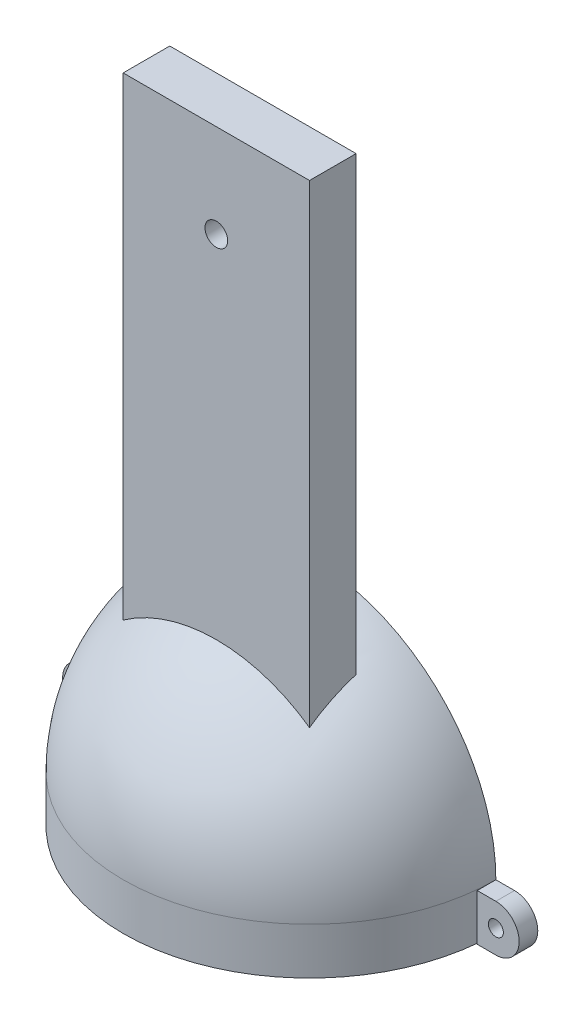
ISO-10303-21;
HEADER;
FILE_DESCRIPTION(('STEP AP214'),'2;1');
FILE_NAME('part.step','',(''),(''),'','','');
FILE_SCHEMA(('AUTOMOTIVE_DESIGN { 1 0 10303 214 1 1 1 1 }'));
ENDSEC;
DATA;
#1=APPLICATION_CONTEXT('core data for automotive mechanical design processes');
#2=APPLICATION_PROTOCOL_DEFINITION('international standard','automotive_design',2000,#1);
#3=PRODUCT_CONTEXT('',#1,'mechanical');
#4=PRODUCT('Part','Part','',(#3));
#5=PRODUCT_RELATED_PRODUCT_CATEGORY('part','',(#4));
#6=PRODUCT_DEFINITION_FORMATION('','',#4);
#7=PRODUCT_DEFINITION_CONTEXT('part definition',#1,'design');
#8=PRODUCT_DEFINITION('design','',#6,#7);
#9=PRODUCT_DEFINITION_SHAPE('','',#8);
#10=(LENGTH_UNIT() NAMED_UNIT(*) SI_UNIT(.MILLI.,.METRE.));
#11=(NAMED_UNIT(*) PLANE_ANGLE_UNIT() SI_UNIT($,.RADIAN.));
#12=(NAMED_UNIT(*) SI_UNIT($,.STERADIAN.) SOLID_ANGLE_UNIT());
#13=UNCERTAINTY_MEASURE_WITH_UNIT(LENGTH_MEASURE(1.E-05),#10,'distance_accuracy_value','');
#14=(GEOMETRIC_REPRESENTATION_CONTEXT(3) GLOBAL_UNCERTAINTY_ASSIGNED_CONTEXT((#13)) GLOBAL_UNIT_ASSIGNED_CONTEXT((#10,
#11,#12)) REPRESENTATION_CONTEXT('',''));
#15=CARTESIAN_POINT('',(0.,0.,0.));
#16=DIRECTION('',(0.,0.,1.));
#17=DIRECTION('',(1.,0.,0.));
#18=AXIS2_PLACEMENT_3D('',#15,#16,#17);
#19=CARTESIAN_POINT('',(-22.,-2.5,2.));
#20=DIRECTION('',(0.,0.,-1.));
#21=DIRECTION('',(-1.,0.,0.));
#22=AXIS2_PLACEMENT_3D('',#19,#20,#21);
#23=CYLINDRICAL_SURFACE('',#22,2.5);
#24=CARTESIAN_POINT('',(-22.,-2.5,0.));
#25=DIRECTION('',(0.,0.,-1.));
#26=DIRECTION('',(1.,0.,0.));
#27=AXIS2_PLACEMENT_3D('',#24,#25,#26);
#28=CIRCLE('',#27,2.5);
#29=CARTESIAN_POINT('',(-22.,-5.,0.));
#30=VERTEX_POINT('',#29);
#31=CARTESIAN_POINT('',(-22.,0.,0.));
#32=VERTEX_POINT('',#31);
#33=EDGE_CURVE('E116',#30,#32,#28,.T.);
#34=ORIENTED_EDGE('',*,*,#33,.F.);
#35=DIRECTION('',(0.,0.,-1.));
#36=VECTOR('',#35,1.);
#37=CARTESIAN_POINT('',(-22.,-5.,2.));
#38=LINE('',#37,#36);
#39=CARTESIAN_POINT('',(-22.,-5.,2.));
#40=VERTEX_POINT('',#39);
#41=EDGE_CURVE('E12',#40,#30,#38,.T.);
#42=ORIENTED_EDGE('',*,*,#41,.F.);
#43=CARTESIAN_POINT('',(-22.,-2.5,2.));
#44=DIRECTION('',(0.,0.,-1.));
#45=DIRECTION('',(1.,0.,0.));
#46=AXIS2_PLACEMENT_3D('',#43,#44,#45);
#47=CIRCLE('',#46,2.5);
#48=CARTESIAN_POINT('',(-22.,0.,2.));
#49=VERTEX_POINT('',#48);
#50=EDGE_CURVE('E109',#40,#49,#47,.T.);
#51=ORIENTED_EDGE('',*,*,#50,.T.);
#52=DIRECTION('',(0.,0.,-1.));
#53=VECTOR('',#52,1.);
#54=CARTESIAN_POINT('',(-22.,0.,2.));
#55=LINE('',#54,#53);
#56=EDGE_CURVE('E54',#49,#32,#55,.T.);
#57=ORIENTED_EDGE('',*,*,#56,.T.);
#58=EDGE_LOOP('',(#34,#42,#51,#57));
#59=FACE_BOUND('',#58,.T.);
#60=ADVANCED_FACE('F51',(#59),#23,.T.);
#61=CARTESIAN_POINT('',(-22.,-5.,2.));
#62=DIRECTION('',(0.,-1.,0.));
#63=DIRECTION('',(0.,0.,-1.));
#64=AXIS2_PLACEMENT_3D('',#61,#62,#63);
#65=PLANE('',#64);
#66=DIRECTION('',(-1.,0.,0.));
#67=VECTOR('',#66,1.);
#68=CARTESIAN_POINT('',(-22.,-5.,0.));
#69=LINE('',#68,#67);
#70=CARTESIAN_POINT('',(-20.,-5.,0.));
#71=VERTEX_POINT('',#70);
#72=EDGE_CURVE('E111',#71,#30,#69,.T.);
#73=ORIENTED_EDGE('',*,*,#72,.F.);
#74=DIRECTION('',(0.,0.,-1.));
#75=VECTOR('',#74,1.);
#76=CARTESIAN_POINT('',(-20.,-5.,2.));
#77=LINE('',#76,#75);
#78=CARTESIAN_POINT('',(-20.,-5.,2.));
#79=VERTEX_POINT('',#78);
#80=EDGE_CURVE('E60',#79,#71,#77,.T.);
#81=ORIENTED_EDGE('',*,*,#80,.F.);
#82=DIRECTION('',(-1.,0.,0.));
#83=VECTOR('',#82,1.);
#84=CARTESIAN_POINT('',(-22.,-5.,2.));
#85=LINE('',#84,#83);
#86=EDGE_CURVE('E106',#79,#40,#85,.T.);
#87=ORIENTED_EDGE('',*,*,#86,.T.);
#88=ORIENTED_EDGE('',*,*,#41,.T.);
#89=EDGE_LOOP('',(#73,#81,#87,#88));
#90=FACE_BOUND('',#89,.T.);
#91=ADVANCED_FACE('F127',(#90),#65,.T.);
#92=CARTESIAN_POINT('',(-20.,-5.,2.));
#93=DIRECTION('',(1.,0.,0.));
#94=DIRECTION('',(0.,1.,0.));
#95=AXIS2_PLACEMENT_3D('',#92,#93,#94);
#96=PLANE('',#95);
#97=DIRECTION('',(0.,-1.,0.));
#98=VECTOR('',#97,1.);
#99=CARTESIAN_POINT('',(-20.,-5.,0.));
#100=LINE('',#99,#98);
#101=CARTESIAN_POINT('',(-20.,0.,0.));
#102=VERTEX_POINT('',#101);
#103=EDGE_CURVE('E101',#102,#71,#100,.T.);
#104=ORIENTED_EDGE('',*,*,#103,.F.);
#105=DIRECTION('',(0.,0.,-1.));
#106=VECTOR('',#105,1.);
#107=CARTESIAN_POINT('',(-20.,0.,2.));
#108=LINE('',#107,#106);
#109=CARTESIAN_POINT('',(-20.,0.,2.));
#110=VERTEX_POINT('',#109);
#111=EDGE_CURVE('E96',#110,#102,#108,.T.);
#112=ORIENTED_EDGE('',*,*,#111,.F.);
#113=DIRECTION('',(0.,-1.,0.));
#114=VECTOR('',#113,1.);
#115=CARTESIAN_POINT('',(-20.,-5.,2.));
#116=LINE('',#115,#114);
#117=EDGE_CURVE('E99',#110,#79,#116,.T.);
#118=ORIENTED_EDGE('',*,*,#117,.T.);
#119=ORIENTED_EDGE('',*,*,#80,.T.);
#120=EDGE_LOOP('',(#104,#112,#118,#119));
#121=FACE_BOUND('',#120,.T.);
#122=ADVANCED_FACE('F98',(#121),#96,.T.);
#123=CARTESIAN_POINT('',(-22.,0.,2.));
#124=DIRECTION('',(0.,1.,0.));
#125=DIRECTION('',(0.,0.,1.));
#126=AXIS2_PLACEMENT_3D('',#123,#124,#125);
#127=PLANE('',#126);
#128=DIRECTION('',(1.,0.,0.));
#129=VECTOR('',#128,1.);
#130=CARTESIAN_POINT('',(-22.,0.,0.));
#131=LINE('',#130,#129);
#132=EDGE_CURVE('E119',#32,#102,#131,.T.);
#133=ORIENTED_EDGE('',*,*,#132,.F.);
#134=ORIENTED_EDGE('',*,*,#56,.F.);
#135=DIRECTION('',(1.,0.,0.));
#136=VECTOR('',#135,1.);
#137=CARTESIAN_POINT('',(-22.,0.,2.));
#138=LINE('',#137,#136);
#139=EDGE_CURVE('E105',#49,#110,#138,.T.);
#140=ORIENTED_EDGE('',*,*,#139,.T.);
#141=ORIENTED_EDGE('',*,*,#111,.T.);
#142=EDGE_LOOP('',(#133,#134,#140,#141));
#143=FACE_BOUND('',#142,.T.);
#144=ADVANCED_FACE('F108',(#143),#127,.T.);
#145=CARTESIAN_POINT('',(-22.,-2.5,2.));
#146=DIRECTION('',(0.,0.,1.));
#147=DIRECTION('',(1.,0.,0.));
#148=AXIS2_PLACEMENT_3D('',#145,#146,#147);
#149=PLANE('',#148);
#150=CARTESIAN_POINT('',(-22.,-2.5,2.));
#151=DIRECTION('',(0.,0.,1.));
#152=DIRECTION('',(1.,0.,0.));
#153=AXIS2_PLACEMENT_3D('',#150,#151,#152);
#154=CIRCLE('',#153,0.805000000000001);
#155=CARTESIAN_POINT('',(-21.195,-2.5,2.));
#156=VERTEX_POINT('',#155);
#157=EDGE_CURVE('E120',#156,#156,#154,.T.);
#158=ORIENTED_EDGE('',*,*,#157,.F.);
#159=EDGE_LOOP('',(#158));
#160=FACE_BOUND('',#159,.T.);
#161=ORIENTED_EDGE('',*,*,#50,.F.);
#162=ORIENTED_EDGE('',*,*,#86,.F.);
#163=ORIENTED_EDGE('',*,*,#117,.F.);
#164=ORIENTED_EDGE('',*,*,#139,.F.);
#165=EDGE_LOOP('',(#161,#162,#163,#164));
#166=FACE_BOUND('',#165,.T.);
#167=ADVANCED_FACE('F104',(#160,#166),#149,.T.);
#168=CARTESIAN_POINT('',(-22.,-2.5,0.));
#169=DIRECTION('',(0.,0.,1.));
#170=DIRECTION('',(1.,0.,0.));
#171=AXIS2_PLACEMENT_3D('',#168,#169,#170);
#172=PLANE('',#171);
#173=CARTESIAN_POINT('',(-22.,-2.5,0.));
#174=DIRECTION('',(0.,0.,-1.));
#175=DIRECTION('',(-1.,0.,0.));
#176=AXIS2_PLACEMENT_3D('',#173,#174,#175);
#177=CIRCLE('',#176,0.805000000000001);
#178=CARTESIAN_POINT('',(-22.805,-2.5,0.));
#179=VERTEX_POINT('',#178);
#180=EDGE_CURVE('E157',#179,#179,#177,.T.);
#181=ORIENTED_EDGE('',*,*,#180,.F.);
#182=EDGE_LOOP('',(#181));
#183=FACE_BOUND('',#182,.T.);
#184=ORIENTED_EDGE('',*,*,#33,.T.);
#185=ORIENTED_EDGE('',*,*,#132,.T.);
#186=ORIENTED_EDGE('',*,*,#103,.T.);
#187=ORIENTED_EDGE('',*,*,#72,.T.);
#188=EDGE_LOOP('',(#184,#185,#186,#187));
#189=FACE_BOUND('',#188,.T.);
#190=ADVANCED_FACE('F126',(#183,#189),#172,.F.);
#191=CARTESIAN_POINT('',(-22.,-2.5,10.));
#192=DIRECTION('',(0.,0.,-1.));
#193=DIRECTION('',(-1.,0.,0.));
#194=AXIS2_PLACEMENT_3D('',#191,#192,#193);
#195=CYLINDRICAL_SURFACE('',#194,0.805000000000001);
#196=ORIENTED_EDGE('',*,*,#157,.T.);
#197=EDGE_LOOP('',(#196));
#198=FACE_BOUND('',#197,.T.);
#199=ORIENTED_EDGE('',*,*,#180,.T.);
#200=EDGE_LOOP('',(#199));
#201=FACE_BOUND('',#200,.T.);
#202=ADVANCED_FACE('F145',(#198,#201),#195,.F.);
#203=CLOSED_SHELL('',(#60,#91,#122,#144,#167,#190,#202));
#204=MANIFOLD_SOLID_BREP('B2',#203);
#205=CARTESIAN_POINT('',(20.,0.,2.));
#206=DIRECTION('',(-1.,0.,0.));
#207=DIRECTION('',(0.,-1.,0.));
#208=AXIS2_PLACEMENT_3D('',#205,#206,#207);
#209=PLANE('',#208);
#210=DIRECTION('',(0.,1.,0.));
#211=VECTOR('',#210,1.);
#212=CARTESIAN_POINT('',(20.,0.,0.));
#213=LINE('',#212,#211);
#214=CARTESIAN_POINT('',(20.,-5.,0.));
#215=VERTEX_POINT('',#214);
#216=CARTESIAN_POINT('',(20.,0.,0.));
#217=VERTEX_POINT('',#216);
#218=EDGE_CURVE('E269',#215,#217,#213,.T.);
#219=ORIENTED_EDGE('',*,*,#218,.F.);
#220=DIRECTION('',(0.,0.,-1.));
#221=VECTOR('',#220,1.);
#222=CARTESIAN_POINT('',(20.,-5.,2.));
#223=LINE('',#222,#221);
#224=CARTESIAN_POINT('',(20.,-5.,2.));
#225=VERTEX_POINT('',#224);
#226=EDGE_CURVE('E49',#225,#215,#223,.T.);
#227=ORIENTED_EDGE('',*,*,#226,.F.);
#228=DIRECTION('',(0.,1.,0.));
#229=VECTOR('',#228,1.);
#230=CARTESIAN_POINT('',(20.,0.,2.));
#231=LINE('',#230,#229);
#232=CARTESIAN_POINT('',(20.,0.,2.));
#233=VERTEX_POINT('',#232);
#234=EDGE_CURVE('E262',#225,#233,#231,.T.);
#235=ORIENTED_EDGE('',*,*,#234,.T.);
#236=DIRECTION('',(0.,0.,-1.));
#237=VECTOR('',#236,1.);
#238=CARTESIAN_POINT('',(20.,0.,2.));
#239=LINE('',#238,#237);
#240=EDGE_CURVE('E207',#233,#217,#239,.T.);
#241=ORIENTED_EDGE('',*,*,#240,.T.);
#242=EDGE_LOOP('',(#219,#227,#235,#241));
#243=FACE_BOUND('',#242,.T.);
#244=ADVANCED_FACE('F204',(#243),#209,.T.);
#245=CARTESIAN_POINT('',(22.,-5.,2.));
#246=DIRECTION('',(0.,-1.,0.));
#247=DIRECTION('',(0.,0.,-1.));
#248=AXIS2_PLACEMENT_3D('',#245,#246,#247);
#249=PLANE('',#248);
#250=DIRECTION('',(-1.,0.,0.));
#251=VECTOR('',#250,1.);
#252=CARTESIAN_POINT('',(22.,-5.,0.));
#253=LINE('',#252,#251);
#254=CARTESIAN_POINT('',(22.,-5.,0.));
#255=VERTEX_POINT('',#254);
#256=EDGE_CURVE('E264',#255,#215,#253,.T.);
#257=ORIENTED_EDGE('',*,*,#256,.F.);
#258=DIRECTION('',(0.,0.,-1.));
#259=VECTOR('',#258,1.);
#260=CARTESIAN_POINT('',(22.,-5.,2.));
#261=LINE('',#260,#259);
#262=CARTESIAN_POINT('',(22.,-5.,2.));
#263=VERTEX_POINT('',#262);
#264=EDGE_CURVE('E213',#263,#255,#261,.T.);
#265=ORIENTED_EDGE('',*,*,#264,.F.);
#266=DIRECTION('',(-1.,0.,0.));
#267=VECTOR('',#266,1.);
#268=CARTESIAN_POINT('',(22.,-5.,2.));
#269=LINE('',#268,#267);
#270=EDGE_CURVE('E259',#263,#225,#269,.T.);
#271=ORIENTED_EDGE('',*,*,#270,.T.);
#272=ORIENTED_EDGE('',*,*,#226,.T.);
#273=EDGE_LOOP('',(#257,#265,#271,#272));
#274=FACE_BOUND('',#273,.T.);
#275=ADVANCED_FACE('F280',(#274),#249,.T.);
#276=CARTESIAN_POINT('',(22.,-2.5,2.));
#277=DIRECTION('',(0.,0.,-1.));
#278=DIRECTION('',(-1.,0.,0.));
#279=AXIS2_PLACEMENT_3D('',#276,#277,#278);
#280=CYLINDRICAL_SURFACE('',#279,2.5);
#281=CARTESIAN_POINT('',(22.,-2.5,0.));
#282=DIRECTION('',(0.,0.,-1.));
#283=DIRECTION('',(-1.,0.,0.));
#284=AXIS2_PLACEMENT_3D('',#281,#282,#283);
#285=CIRCLE('',#284,2.5);
#286=CARTESIAN_POINT('',(22.,0.,0.));
#287=VERTEX_POINT('',#286);
#288=EDGE_CURVE('E254',#287,#255,#285,.T.);
#289=ORIENTED_EDGE('',*,*,#288,.F.);
#290=DIRECTION('',(0.,0.,-1.));
#291=VECTOR('',#290,1.);
#292=CARTESIAN_POINT('',(22.,0.,2.));
#293=LINE('',#292,#291);
#294=CARTESIAN_POINT('',(22.,0.,2.));
#295=VERTEX_POINT('',#294);
#296=EDGE_CURVE('E249',#295,#287,#293,.T.);
#297=ORIENTED_EDGE('',*,*,#296,.F.);
#298=CARTESIAN_POINT('',(22.,-2.5,2.));
#299=DIRECTION('',(0.,0.,-1.));
#300=DIRECTION('',(-1.,0.,0.));
#301=AXIS2_PLACEMENT_3D('',#298,#299,#300);
#302=CIRCLE('',#301,2.5);
#303=EDGE_CURVE('E252',#295,#263,#302,.T.);
#304=ORIENTED_EDGE('',*,*,#303,.T.);
#305=ORIENTED_EDGE('',*,*,#264,.T.);
#306=EDGE_LOOP('',(#289,#297,#304,#305));
#307=FACE_BOUND('',#306,.T.);
#308=ADVANCED_FACE('F251',(#307),#280,.T.);
#309=CARTESIAN_POINT('',(22.,0.,2.));
#310=DIRECTION('',(0.,1.,0.));
#311=DIRECTION('',(0.,0.,1.));
#312=AXIS2_PLACEMENT_3D('',#309,#310,#311);
#313=PLANE('',#312);
#314=DIRECTION('',(1.,0.,0.));
#315=VECTOR('',#314,1.);
#316=CARTESIAN_POINT('',(22.,0.,0.));
#317=LINE('',#316,#315);
#318=EDGE_CURVE('E272',#217,#287,#317,.T.);
#319=ORIENTED_EDGE('',*,*,#318,.F.);
#320=ORIENTED_EDGE('',*,*,#240,.F.);
#321=DIRECTION('',(1.,0.,0.));
#322=VECTOR('',#321,1.);
#323=CARTESIAN_POINT('',(22.,0.,2.));
#324=LINE('',#323,#322);
#325=EDGE_CURVE('E258',#233,#295,#324,.T.);
#326=ORIENTED_EDGE('',*,*,#325,.T.);
#327=ORIENTED_EDGE('',*,*,#296,.T.);
#328=EDGE_LOOP('',(#319,#320,#326,#327));
#329=FACE_BOUND('',#328,.T.);
#330=ADVANCED_FACE('F261',(#329),#313,.T.);
#331=CARTESIAN_POINT('',(22.,-2.5,2.));
#332=DIRECTION('',(0.,0.,-1.));
#333=DIRECTION('',(-1.,0.,0.));
#334=AXIS2_PLACEMENT_3D('',#331,#332,#333);
#335=PLANE('',#334);
#336=CARTESIAN_POINT('',(22.,-2.5,2.));
#337=DIRECTION('',(0.,0.,-1.));
#338=DIRECTION('',(-1.,0.,0.));
#339=AXIS2_PLACEMENT_3D('',#336,#337,#338);
#340=CIRCLE('',#339,0.805000000000001);
#341=CARTESIAN_POINT('',(21.195,-2.5,2.));
#342=VERTEX_POINT('',#341);
#343=EDGE_CURVE('E273',#342,#342,#340,.T.);
#344=ORIENTED_EDGE('',*,*,#343,.T.);
#345=EDGE_LOOP('',(#344));
#346=FACE_BOUND('',#345,.T.);
#347=ORIENTED_EDGE('',*,*,#234,.F.);
#348=ORIENTED_EDGE('',*,*,#270,.F.);
#349=ORIENTED_EDGE('',*,*,#303,.F.);
#350=ORIENTED_EDGE('',*,*,#325,.F.);
#351=EDGE_LOOP('',(#347,#348,#349,#350));
#352=FACE_BOUND('',#351,.T.);
#353=ADVANCED_FACE('F257',(#346,#352),#335,.F.);
#354=CARTESIAN_POINT('',(22.,-2.5,0.));
#355=DIRECTION('',(0.,0.,-1.));
#356=DIRECTION('',(-1.,0.,0.));
#357=AXIS2_PLACEMENT_3D('',#354,#355,#356);
#358=PLANE('',#357);
#359=CARTESIAN_POINT('',(22.,-2.5,0.));
#360=DIRECTION('',(0.,0.,-1.));
#361=DIRECTION('',(-1.,0.,0.));
#362=AXIS2_PLACEMENT_3D('',#359,#360,#361);
#363=CIRCLE('',#362,0.805000000000001);
#364=CARTESIAN_POINT('',(21.195,-2.5,0.));
#365=VERTEX_POINT('',#364);
#366=EDGE_CURVE('E309',#365,#365,#363,.T.);
#367=ORIENTED_EDGE('',*,*,#366,.F.);
#368=EDGE_LOOP('',(#367));
#369=FACE_BOUND('',#368,.T.);
#370=ORIENTED_EDGE('',*,*,#218,.T.);
#371=ORIENTED_EDGE('',*,*,#318,.T.);
#372=ORIENTED_EDGE('',*,*,#288,.T.);
#373=ORIENTED_EDGE('',*,*,#256,.T.);
#374=EDGE_LOOP('',(#370,#371,#372,#373));
#375=FACE_BOUND('',#374,.T.);
#376=ADVANCED_FACE('F279',(#369,#375),#358,.T.);
#377=CARTESIAN_POINT('',(22.,-2.5,10.));
#378=DIRECTION('',(0.,0.,-1.));
#379=DIRECTION('',(-1.,0.,0.));
#380=AXIS2_PLACEMENT_3D('',#377,#378,#379);
#381=CYLINDRICAL_SURFACE('',#380,0.805000000000001);
#382=ORIENTED_EDGE('',*,*,#366,.T.);
#383=EDGE_LOOP('',(#382));
#384=FACE_BOUND('',#383,.T.);
#385=ORIENTED_EDGE('',*,*,#343,.F.);
#386=EDGE_LOOP('',(#385));
#387=FACE_BOUND('',#386,.T.);
#388=ADVANCED_FACE('F298',(#384,#387),#381,.F.);
#389=CLOSED_SHELL('',(#244,#275,#308,#330,#353,#376,#388));
#390=MANIFOLD_SOLID_BREP('B6',#389);
#391=CARTESIAN_POINT('',(0.,0.,0.));
#392=DIRECTION('',(-1.,0.,0.));
#393=DIRECTION('',(0.,0.,1.));
#394=AXIS2_PLACEMENT_3D('',#391,#392,#393);
#395=SPHERICAL_SURFACE('',#394,20.);
#396=CARTESIAN_POINT('',(0.,0.,0.));
#397=DIRECTION('',(0.,0.,1.));
#398=DIRECTION('',(1.,0.,0.));
#399=AXIS2_PLACEMENT_3D('',#396,#397,#398);
#400=CIRCLE('',#399,20.);
#401=CARTESIAN_POINT('',(20.,0.,0.));
#402=VERTEX_POINT('',#401);
#403=CARTESIAN_POINT('',(-20.,0.,0.));
#404=VERTEX_POINT('',#403);
#405=EDGE_CURVE('E476',#402,#404,#400,.T.);
#406=ORIENTED_EDGE('',*,*,#405,.T.);
#407=CARTESIAN_POINT('',(0.,0.,0.));
#408=DIRECTION('',(0.,-1.,0.));
#409=DIRECTION('',(1.,0.,0.));
#410=AXIS2_PLACEMENT_3D('',#407,#408,#409);
#411=CIRCLE('',#410,20.);
#412=EDGE_CURVE('E428',#402,#404,#411,.T.);
#413=ORIENTED_EDGE('',*,*,#412,.F.);
#414=EDGE_LOOP('',(#406,#413));
#415=FACE_BOUND('',#414,.T.);
#416=CARTESIAN_POINT('',(9.99999999999999,0.,0.));
#417=DIRECTION('',(-1.,0.,0.));
#418=DIRECTION('',(0.,0.,1.));
#419=AXIS2_PLACEMENT_3D('',#416,#417,#418);
#420=CIRCLE('',#419,17.3205080756888);
#421=CARTESIAN_POINT('',(10.,14.142135623731,10.));
#422=VERTEX_POINT('',#421);
#423=CARTESIAN_POINT('',(10.,16.583123951777,5.));
#424=VERTEX_POINT('',#423);
#425=EDGE_CURVE('E355',#422,#424,#420,.T.);
#426=ORIENTED_EDGE('',*,*,#425,.F.);
#427=CARTESIAN_POINT('',(0.,0.,10.));
#428=DIRECTION('',(0.,0.,-1.));
#429=DIRECTION('',(-1.,0.,0.));
#430=AXIS2_PLACEMENT_3D('',#427,#428,#429);
#431=CIRCLE('',#430,17.3205080756888);
#432=CARTESIAN_POINT('',(-10.,14.1421356237309,10.));
#433=VERTEX_POINT('',#432);
#434=EDGE_CURVE('E414',#433,#422,#431,.T.);
#435=ORIENTED_EDGE('',*,*,#434,.F.);
#436=CARTESIAN_POINT('',(-10.,0.,0.));
#437=DIRECTION('',(1.,0.,0.));
#438=DIRECTION('',(0.,0.,-1.));
#439=AXIS2_PLACEMENT_3D('',#436,#437,#438);
#440=CIRCLE('',#439,17.3205080756888);
#441=CARTESIAN_POINT('',(-10.,16.583123951777,5.));
#442=VERTEX_POINT('',#441);
#443=EDGE_CURVE('E367',#442,#433,#440,.T.);
#444=ORIENTED_EDGE('',*,*,#443,.F.);
#445=CARTESIAN_POINT('',(0.,0.,5.));
#446=DIRECTION('',(0.,0.,1.));
#447=DIRECTION('',(1.,0.,0.));
#448=AXIS2_PLACEMENT_3D('',#445,#446,#447);
#449=CIRCLE('',#448,19.3649167310371);
#450=EDGE_CURVE('E362',#424,#442,#449,.T.);
#451=ORIENTED_EDGE('',*,*,#450,.F.);
#452=EDGE_LOOP('',(#426,#435,#444,#451));
#453=FACE_BOUND('',#452,.T.);
#454=ADVANCED_FACE('F348',(#415,#453),#395,.T.);
#455=CARTESIAN_POINT('',(0.,0.,0.));
#456=DIRECTION('',(-1.,0.,0.));
#457=DIRECTION('',(0.,0.,1.));
#458=AXIS2_PLACEMENT_3D('',#455,#456,#457);
#459=SPHERICAL_SURFACE('',#458,15.);
#460=CARTESIAN_POINT('',(0.,0.,0.));
#461=DIRECTION('',(0.,0.,1.));
#462=DIRECTION('',(1.,0.,0.));
#463=AXIS2_PLACEMENT_3D('',#460,#461,#462);
#464=CIRCLE('',#463,15.);
#465=CARTESIAN_POINT('',(15.,0.,0.));
#466=VERTEX_POINT('',#465);
#467=CARTESIAN_POINT('',(-15.,0.,0.));
#468=VERTEX_POINT('',#467);
#469=EDGE_CURVE('E473',#466,#468,#464,.T.);
#470=ORIENTED_EDGE('',*,*,#469,.F.);
#471=CARTESIAN_POINT('',(0.,0.,0.));
#472=DIRECTION('',(0.,-1.,0.));
#473=DIRECTION('',(1.,0.,0.));
#474=AXIS2_PLACEMENT_3D('',#471,#472,#473);
#475=CIRCLE('',#474,15.);
#476=EDGE_CURVE('E479',#466,#468,#475,.T.);
#477=ORIENTED_EDGE('',*,*,#476,.T.);
#478=EDGE_LOOP('',(#470,#477));
#479=FACE_BOUND('',#478,.T.);
#480=ADVANCED_FACE('F535',(#479),#459,.F.);
#481=CARTESIAN_POINT('',(0.,0.,0.));
#482=DIRECTION('',(0.,0.,1.));
#483=DIRECTION('',(1.,0.,0.));
#484=AXIS2_PLACEMENT_3D('',#481,#482,#483);
#485=PLANE('',#484);
#486=ORIENTED_EDGE('',*,*,#469,.T.);
#487=DIRECTION('',(1.,0.,0.));
#488=VECTOR('',#487,1.);
#489=CARTESIAN_POINT('',(-20.,0.,0.));
#490=LINE('',#489,#488);
#491=CARTESIAN_POINT('',(-10.,0.,0.));
#492=VERTEX_POINT('',#491);
#493=EDGE_CURVE('E450',#468,#492,#490,.T.);
#494=ORIENTED_EDGE('',*,*,#493,.T.);
#495=DIRECTION('',(0.,1.,0.));
#496=VECTOR('',#495,1.);
#497=CARTESIAN_POINT('',(-10.,-5.,0.));
#498=LINE('',#497,#496);
#499=CARTESIAN_POINT('',(-10.,-5.,0.));
#500=VERTEX_POINT('',#499);
#501=EDGE_CURVE('E456',#500,#492,#498,.T.);
#502=ORIENTED_EDGE('',*,*,#501,.F.);
#503=DIRECTION('',(1.,0.,0.));
#504=VECTOR('',#503,1.);
#505=CARTESIAN_POINT('',(-20.,-5.,0.));
#506=LINE('',#505,#504);
#507=CARTESIAN_POINT('',(-20.,-5.,0.));
#508=VERTEX_POINT('',#507);
#509=EDGE_CURVE('E454',#508,#500,#506,.T.);
#510=ORIENTED_EDGE('',*,*,#509,.F.);
#511=DIRECTION('',(0.,1.,0.));
#512=VECTOR('',#511,1.);
#513=CARTESIAN_POINT('',(-20.,-5.,0.));
#514=LINE('',#513,#512);
#515=EDGE_CURVE('E465',#508,#404,#514,.T.);
#516=ORIENTED_EDGE('',*,*,#515,.T.);
#517=ORIENTED_EDGE('',*,*,#405,.F.);
#518=DIRECTION('',(0.,1.,0.));
#519=VECTOR('',#518,1.);
#520=CARTESIAN_POINT('',(20.,-5.,0.));
#521=LINE('',#520,#519);
#522=CARTESIAN_POINT('',(20.,-5.,0.));
#523=VERTEX_POINT('',#522);
#524=EDGE_CURVE('E468',#523,#402,#521,.T.);
#525=ORIENTED_EDGE('',*,*,#524,.F.);
#526=DIRECTION('',(1.,0.,0.));
#527=VECTOR('',#526,1.);
#528=CARTESIAN_POINT('',(10.,-5.,0.));
#529=LINE('',#528,#527);
#530=CARTESIAN_POINT('',(10.,-5.,0.));
#531=VERTEX_POINT('',#530);
#532=EDGE_CURVE('E449',#531,#523,#529,.T.);
#533=ORIENTED_EDGE('',*,*,#532,.F.);
#534=DIRECTION('',(0.,1.,0.));
#535=VECTOR('',#534,1.);
#536=CARTESIAN_POINT('',(10.,-5.,0.));
#537=LINE('',#536,#535);
#538=CARTESIAN_POINT('',(10.,0.,0.));
#539=VERTEX_POINT('',#538);
#540=EDGE_CURVE('E470',#531,#539,#537,.T.);
#541=ORIENTED_EDGE('',*,*,#540,.T.);
#542=DIRECTION('',(1.,0.,0.));
#543=VECTOR('',#542,1.);
#544=CARTESIAN_POINT('',(10.,0.,0.));
#545=LINE('',#544,#543);
#546=EDGE_CURVE('E459',#539,#466,#545,.T.);
#547=ORIENTED_EDGE('',*,*,#546,.T.);
#548=EDGE_LOOP('',(#486,#494,#502,#510,#516,#517,#525,#533,#541,#547));
#549=FACE_BOUND('',#548,.T.);
#550=ADVANCED_FACE('F540',(#549),#485,.F.);
#551=CARTESIAN_POINT('',(0.,0.,0.));
#552=DIRECTION('',(0.,-1.,0.));
#553=DIRECTION('',(0.,0.,-1.));
#554=AXIS2_PLACEMENT_3D('',#551,#552,#553);
#555=PLANE('',#554);
#556=ORIENTED_EDGE('',*,*,#476,.F.);
#557=ORIENTED_EDGE('',*,*,#546,.F.);
#558=CARTESIAN_POINT('',(0.,0.,0.));
#559=DIRECTION('',(0.,1.,0.));
#560=DIRECTION('',(0.,0.,-1.));
#561=AXIS2_PLACEMENT_3D('',#558,#559,#560);
#562=CIRCLE('',#561,10.);
#563=EDGE_CURVE('E445',#492,#539,#562,.T.);
#564=ORIENTED_EDGE('',*,*,#563,.F.);
#565=ORIENTED_EDGE('',*,*,#493,.F.);
#566=EDGE_LOOP('',(#556,#557,#564,#565));
#567=FACE_BOUND('',#566,.T.);
#568=ADVANCED_FACE('F561',(#567),#555,.F.);
#569=CARTESIAN_POINT('',(0.,-5.,0.));
#570=DIRECTION('',(0.,1.,0.));
#571=DIRECTION('',(0.,0.,1.));
#572=AXIS2_PLACEMENT_3D('',#569,#570,#571);
#573=CYLINDRICAL_SURFACE('',#572,10.);
#574=ORIENTED_EDGE('',*,*,#563,.T.);
#575=ORIENTED_EDGE('',*,*,#540,.F.);
#576=CARTESIAN_POINT('',(0.,-5.,0.));
#577=DIRECTION('',(0.,1.,0.));
#578=DIRECTION('',(0.,0.,-1.));
#579=AXIS2_PLACEMENT_3D('',#576,#577,#578);
#580=CIRCLE('',#579,10.);
#581=EDGE_CURVE('E446',#500,#531,#580,.T.);
#582=ORIENTED_EDGE('',*,*,#581,.F.);
#583=ORIENTED_EDGE('',*,*,#501,.T.);
#584=EDGE_LOOP('',(#574,#575,#582,#583));
#585=FACE_BOUND('',#584,.T.);
#586=ADVANCED_FACE('F559',(#585),#573,.F.);
#587=CARTESIAN_POINT('',(0.,-5.,0.));
#588=DIRECTION('',(0.,1.,0.));
#589=DIRECTION('',(0.,0.,1.));
#590=AXIS2_PLACEMENT_3D('',#587,#588,#589);
#591=CYLINDRICAL_SURFACE('',#590,20.);
#592=ORIENTED_EDGE('',*,*,#412,.T.);
#593=ORIENTED_EDGE('',*,*,#515,.F.);
#594=CARTESIAN_POINT('',(0.,-5.,0.));
#595=DIRECTION('',(0.,-1.,0.));
#596=DIRECTION('',(0.,0.,-1.));
#597=AXIS2_PLACEMENT_3D('',#594,#595,#596);
#598=CIRCLE('',#597,20.);
#599=EDGE_CURVE('E452',#523,#508,#598,.T.);
#600=ORIENTED_EDGE('',*,*,#599,.F.);
#601=ORIENTED_EDGE('',*,*,#524,.T.);
#602=EDGE_LOOP('',(#592,#593,#600,#601));
#603=FACE_BOUND('',#602,.T.);
#604=ADVANCED_FACE('F551',(#603),#591,.T.);
#605=CARTESIAN_POINT('',(0.,-5.,0.));
#606=DIRECTION('',(0.,-1.,0.));
#607=DIRECTION('',(0.,0.,-1.));
#608=AXIS2_PLACEMENT_3D('',#605,#606,#607);
#609=PLANE('',#608);
#610=ORIENTED_EDGE('',*,*,#581,.T.);
#611=ORIENTED_EDGE('',*,*,#532,.T.);
#612=ORIENTED_EDGE('',*,*,#599,.T.);
#613=ORIENTED_EDGE('',*,*,#509,.T.);
#614=EDGE_LOOP('',(#610,#611,#612,#613));
#615=FACE_BOUND('',#614,.T.);
#616=ADVANCED_FACE('F553',(#615),#609,.T.);
#617=CARTESIAN_POINT('',(-10.,65.,5.));
#618=DIRECTION('',(1.,0.,0.));
#619=DIRECTION('',(0.,0.,-1.));
#620=AXIS2_PLACEMENT_3D('',#617,#618,#619);
#621=PLANE('',#620);
#622=DIRECTION('',(0.,-1.,0.));
#623=VECTOR('',#622,1.);
#624=CARTESIAN_POINT('',(-10.,65.,5.));
#625=LINE('',#624,#623);
#626=CARTESIAN_POINT('',(-10.,65.,5.));
#627=VERTEX_POINT('',#626);
#628=EDGE_CURVE('E435',#627,#442,#625,.T.);
#629=ORIENTED_EDGE('',*,*,#628,.T.);
#630=ORIENTED_EDGE('',*,*,#443,.T.);
#631=DIRECTION('',(0.,-1.,0.));
#632=VECTOR('',#631,1.);
#633=CARTESIAN_POINT('',(-10.,65.,10.));
#634=LINE('',#633,#632);
#635=CARTESIAN_POINT('',(-10.,65.,10.));
#636=VERTEX_POINT('',#635);
#637=EDGE_CURVE('E427',#636,#433,#634,.T.);
#638=ORIENTED_EDGE('',*,*,#637,.F.);
#639=DIRECTION('',(0.,0.,1.));
#640=VECTOR('',#639,1.);
#641=CARTESIAN_POINT('',(-10.,65.,5.));
#642=LINE('',#641,#640);
#643=EDGE_CURVE('E437',#627,#636,#642,.T.);
#644=ORIENTED_EDGE('',*,*,#643,.F.);
#645=EDGE_LOOP('',(#629,#630,#638,#644));
#646=FACE_BOUND('',#645,.T.);
#647=ADVANCED_FACE('F489',(#646),#621,.F.);
#648=CARTESIAN_POINT('',(10.,65.,10.));
#649=DIRECTION('',(0.,0.,-1.));
#650=DIRECTION('',(-1.,0.,0.));
#651=AXIS2_PLACEMENT_3D('',#648,#649,#650);
#652=PLANE('',#651);
#653=CARTESIAN_POINT('',(0.,55.,10.));
#654=DIRECTION('',(0.,0.,-1.));
#655=DIRECTION('',(-1.,0.,0.));
#656=AXIS2_PLACEMENT_3D('',#653,#654,#655);
#657=CIRCLE('',#656,1.22);
#658=CARTESIAN_POINT('',(-1.22,55.,10.));
#659=VERTEX_POINT('',#658);
#660=EDGE_CURVE('E498',#659,#659,#657,.T.);
#661=ORIENTED_EDGE('',*,*,#660,.T.);
#662=EDGE_LOOP('',(#661));
#663=FACE_BOUND('',#662,.T.);
#664=ORIENTED_EDGE('',*,*,#637,.T.);
#665=ORIENTED_EDGE('',*,*,#434,.T.);
#666=DIRECTION('',(0.,-1.,0.));
#667=VECTOR('',#666,1.);
#668=CARTESIAN_POINT('',(10.,65.,10.));
#669=LINE('',#668,#667);
#670=CARTESIAN_POINT('',(10.,65.,10.));
#671=VERTEX_POINT('',#670);
#672=EDGE_CURVE('E424',#671,#422,#669,.T.);
#673=ORIENTED_EDGE('',*,*,#672,.F.);
#674=DIRECTION('',(1.,0.,0.));
#675=VECTOR('',#674,1.);
#676=CARTESIAN_POINT('',(10.,65.,10.));
#677=LINE('',#676,#675);
#678=EDGE_CURVE('E433',#636,#671,#677,.T.);
#679=ORIENTED_EDGE('',*,*,#678,.F.);
#680=EDGE_LOOP('',(#664,#665,#673,#679));
#681=FACE_BOUND('',#680,.T.);
#682=ADVANCED_FACE('F422',(#663,#681),#652,.F.);
#683=CARTESIAN_POINT('',(10.,65.,5.));
#684=DIRECTION('',(-1.,0.,0.));
#685=DIRECTION('',(0.,0.,1.));
#686=AXIS2_PLACEMENT_3D('',#683,#684,#685);
#687=PLANE('',#686);
#688=ORIENTED_EDGE('',*,*,#672,.T.);
#689=ORIENTED_EDGE('',*,*,#425,.T.);
#690=DIRECTION('',(0.,-1.,0.));
#691=VECTOR('',#690,1.);
#692=CARTESIAN_POINT('',(10.,65.,5.));
#693=LINE('',#692,#691);
#694=CARTESIAN_POINT('',(10.,65.,5.));
#695=VERTEX_POINT('',#694);
#696=EDGE_CURVE('E443',#695,#424,#693,.T.);
#697=ORIENTED_EDGE('',*,*,#696,.F.);
#698=DIRECTION('',(0.,0.,-1.));
#699=VECTOR('',#698,1.);
#700=CARTESIAN_POINT('',(10.,65.,5.));
#701=LINE('',#700,#699);
#702=EDGE_CURVE('E432',#671,#695,#701,.T.);
#703=ORIENTED_EDGE('',*,*,#702,.F.);
#704=EDGE_LOOP('',(#688,#689,#697,#703));
#705=FACE_BOUND('',#704,.T.);
#706=ADVANCED_FACE('F430',(#705),#687,.F.);
#707=CARTESIAN_POINT('',(10.,65.,5.));
#708=DIRECTION('',(0.,0.,1.));
#709=DIRECTION('',(1.,0.,0.));
#710=AXIS2_PLACEMENT_3D('',#707,#708,#709);
#711=PLANE('',#710);
#712=CARTESIAN_POINT('',(0.,55.,5.));
#713=DIRECTION('',(0.,0.,1.));
#714=DIRECTION('',(1.,0.,0.));
#715=AXIS2_PLACEMENT_3D('',#712,#713,#714);
#716=CIRCLE('',#715,5.);
#717=CARTESIAN_POINT('',(5.,55.,5.));
#718=VERTEX_POINT('',#717);
#719=EDGE_CURVE('E202',#718,#718,#716,.F.);
#720=ORIENTED_EDGE('',*,*,#719,.F.);
#721=EDGE_LOOP('',(#720));
#722=FACE_BOUND('',#721,.T.);
#723=ORIENTED_EDGE('',*,*,#696,.T.);
#724=ORIENTED_EDGE('',*,*,#450,.T.);
#725=ORIENTED_EDGE('',*,*,#628,.F.);
#726=DIRECTION('',(-1.,0.,0.));
#727=VECTOR('',#726,1.);
#728=CARTESIAN_POINT('',(10.,65.,5.));
#729=LINE('',#728,#727);
#730=EDGE_CURVE('E491',#695,#627,#729,.T.);
#731=ORIENTED_EDGE('',*,*,#730,.F.);
#732=EDGE_LOOP('',(#723,#724,#725,#731));
#733=FACE_BOUND('',#732,.T.);
#734=ADVANCED_FACE('F486',(#722,#733),#711,.F.);
#735=CARTESIAN_POINT('',(0.,65.,0.));
#736=DIRECTION('',(0.,-1.,0.));
#737=DIRECTION('',(0.,0.,-1.));
#738=AXIS2_PLACEMENT_3D('',#735,#736,#737);
#739=PLANE('',#738);
#740=ORIENTED_EDGE('',*,*,#702,.T.);
#741=ORIENTED_EDGE('',*,*,#730,.T.);
#742=ORIENTED_EDGE('',*,*,#643,.T.);
#743=ORIENTED_EDGE('',*,*,#678,.T.);
#744=EDGE_LOOP('',(#740,#741,#742,#743));
#745=FACE_BOUND('',#744,.T.);
#746=ADVANCED_FACE('F521',(#745),#739,.F.);
#747=CARTESIAN_POINT('',(0.,55.,0.));
#748=DIRECTION('',(0.,0.,1.));
#749=DIRECTION('',(1.,0.,0.));
#750=AXIS2_PLACEMENT_3D('',#747,#748,#749);
#751=CYLINDRICAL_SURFACE('',#750,5.);
#752=CARTESIAN_POINT('',(0.,55.,0.));
#753=DIRECTION('',(0.,0.,-1.));
#754=DIRECTION('',(-1.,0.,0.));
#755=AXIS2_PLACEMENT_3D('',#752,#753,#754);
#756=CIRCLE('',#755,5.);
#757=CARTESIAN_POINT('',(-5.,55.,0.));
#758=VERTEX_POINT('',#757);
#759=EDGE_CURVE('E495',#758,#758,#756,.T.);
#760=ORIENTED_EDGE('',*,*,#759,.F.);
#761=EDGE_LOOP('',(#760));
#762=FACE_BOUND('',#761,.T.);
#763=ORIENTED_EDGE('',*,*,#719,.T.);
#764=EDGE_LOOP('',(#763));
#765=FACE_BOUND('',#764,.T.);
#766=ADVANCED_FACE('F515',(#762,#765),#751,.T.);
#767=CARTESIAN_POINT('',(0.,55.,0.));
#768=DIRECTION('',(0.,0.,-1.));
#769=DIRECTION('',(-1.,0.,0.));
#770=AXIS2_PLACEMENT_3D('',#767,#768,#769);
#771=PLANE('',#770);
#772=CARTESIAN_POINT('',(0.,55.,0.));
#773=DIRECTION('',(0.,0.,-1.));
#774=DIRECTION('',(-1.,0.,0.));
#775=AXIS2_PLACEMENT_3D('',#772,#773,#774);
#776=CIRCLE('',#775,1.22);
#777=CARTESIAN_POINT('',(-1.22,55.,0.));
#778=VERTEX_POINT('',#777);
#779=EDGE_CURVE('E499',#778,#778,#776,.T.);
#780=ORIENTED_EDGE('',*,*,#779,.F.);
#781=EDGE_LOOP('',(#780));
#782=FACE_BOUND('',#781,.T.);
#783=ORIENTED_EDGE('',*,*,#759,.T.);
#784=EDGE_LOOP('',(#783));
#785=FACE_BOUND('',#784,.T.);
#786=ADVANCED_FACE('F509',(#782,#785),#771,.T.);
#787=CARTESIAN_POINT('',(0.,55.,10.));
#788=DIRECTION('',(0.,0.,-1.));
#789=DIRECTION('',(-1.,0.,0.));
#790=AXIS2_PLACEMENT_3D('',#787,#788,#789);
#791=CYLINDRICAL_SURFACE('',#790,1.22);
#792=ORIENTED_EDGE('',*,*,#660,.F.);
#793=EDGE_LOOP('',(#792));
#794=FACE_BOUND('',#793,.T.);
#795=ORIENTED_EDGE('',*,*,#779,.T.);
#796=EDGE_LOOP('',(#795));
#797=FACE_BOUND('',#796,.T.);
#798=ADVANCED_FACE('F506',(#794,#797),#791,.F.);
#799=CLOSED_SHELL('',(#454,#480,#550,#568,#586,#604,#616,#647,#682,#706,#734,#746,#766,#786,#798));
#800=MANIFOLD_SOLID_BREP('B43',#799);
#801=ADVANCED_BREP_SHAPE_REPRESENTATION('',(#18,#204,#390,#800),#14);
#802=SHAPE_DEFINITION_REPRESENTATION(#9,#801);
ENDSEC;
END-ISO-10303-21;
